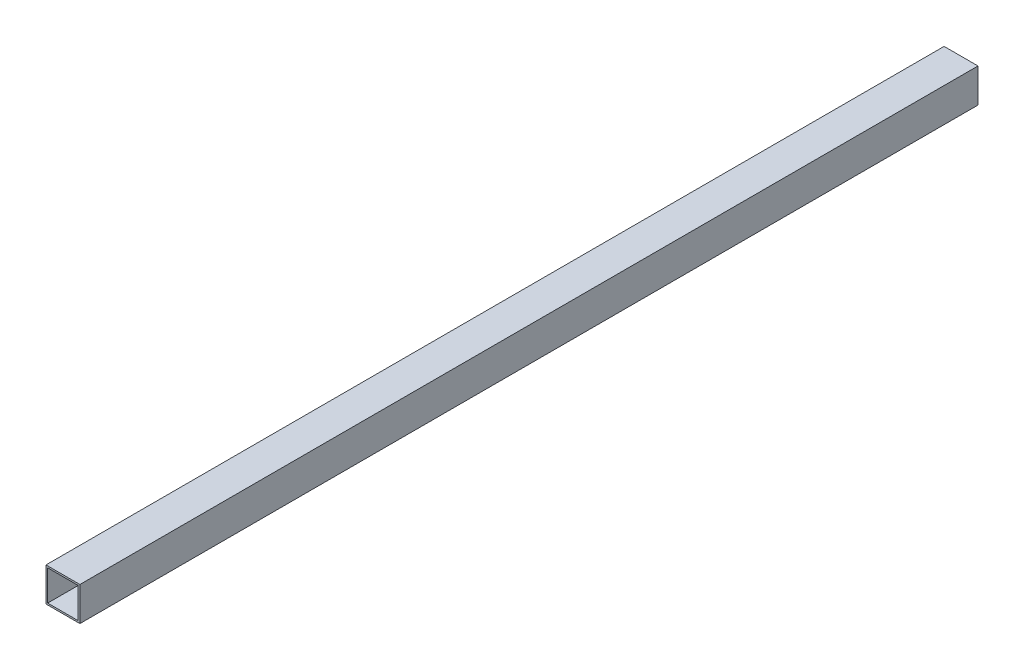
ISO-10303-21;
HEADER;
FILE_DESCRIPTION(('STEP AP214'),'2;1');
FILE_NAME('part.step','',(''),(''),'','','');
FILE_SCHEMA(('AUTOMOTIVE_DESIGN { 1 0 10303 214 1 1 1 1 }'));
ENDSEC;
DATA;
#1=APPLICATION_CONTEXT('core data for automotive mechanical design processes');
#2=APPLICATION_PROTOCOL_DEFINITION('international standard','automotive_design',2000,#1);
#3=PRODUCT_CONTEXT('',#1,'mechanical');
#4=PRODUCT('Part','Part','',(#3));
#5=PRODUCT_RELATED_PRODUCT_CATEGORY('part','',(#4));
#6=PRODUCT_DEFINITION_FORMATION('','',#4);
#7=PRODUCT_DEFINITION_CONTEXT('part definition',#1,'design');
#8=PRODUCT_DEFINITION('design','',#6,#7);
#9=PRODUCT_DEFINITION_SHAPE('','',#8);
#10=(LENGTH_UNIT() NAMED_UNIT(*) SI_UNIT(.MILLI.,.METRE.));
#11=(NAMED_UNIT(*) PLANE_ANGLE_UNIT() SI_UNIT($,.RADIAN.));
#12=(NAMED_UNIT(*) SI_UNIT($,.STERADIAN.) SOLID_ANGLE_UNIT());
#13=UNCERTAINTY_MEASURE_WITH_UNIT(LENGTH_MEASURE(1.E-05),#10,'distance_accuracy_value','');
#14=(GEOMETRIC_REPRESENTATION_CONTEXT(3) GLOBAL_UNCERTAINTY_ASSIGNED_CONTEXT((#13)) GLOBAL_UNIT_ASSIGNED_CONTEXT((#10,
#11,#12)) REPRESENTATION_CONTEXT('',''));
#15=CARTESIAN_POINT('',(0.,0.,0.));
#16=DIRECTION('',(0.,0.,1.));
#17=DIRECTION('',(1.,0.,0.));
#18=AXIS2_PLACEMENT_3D('',#15,#16,#17);
#19=CARTESIAN_POINT('',(-20.,-20.,1060.));
#20=DIRECTION('',(0.,0.,1.));
#21=DIRECTION('',(1.,0.,0.));
#22=AXIS2_PLACEMENT_3D('',#19,#20,#21);
#23=PLANE('',#22);
#24=DIRECTION('',(0.,-1.,0.));
#25=VECTOR('',#24,1.);
#26=CARTESIAN_POINT('',(-20.,-20.,1060.));
#27=LINE('',#26,#25);
#28=CARTESIAN_POINT('',(-20.,20.,1060.));
#29=VERTEX_POINT('',#28);
#30=CARTESIAN_POINT('',(-20.,-20.,1060.));
#31=VERTEX_POINT('',#30);
#32=EDGE_CURVE('E157',#29,#31,#27,.T.);
#33=ORIENTED_EDGE('',*,*,#32,.T.);
#34=DIRECTION('',(1.,0.,0.));
#35=VECTOR('',#34,1.);
#36=CARTESIAN_POINT('',(20.,-20.,1060.));
#37=LINE('',#36,#35);
#38=CARTESIAN_POINT('',(20.,-20.,1060.));
#39=VERTEX_POINT('',#38);
#40=EDGE_CURVE('E160',#31,#39,#37,.T.);
#41=ORIENTED_EDGE('',*,*,#40,.T.);
#42=DIRECTION('',(0.,1.,0.));
#43=VECTOR('',#42,1.);
#44=CARTESIAN_POINT('',(20.,-20.,1060.));
#45=LINE('',#44,#43);
#46=CARTESIAN_POINT('',(20.,20.,1060.));
#47=VERTEX_POINT('',#46);
#48=EDGE_CURVE('E163',#39,#47,#45,.T.);
#49=ORIENTED_EDGE('',*,*,#48,.T.);
#50=DIRECTION('',(-1.,0.,0.));
#51=VECTOR('',#50,1.);
#52=CARTESIAN_POINT('',(20.,20.,1060.));
#53=LINE('',#52,#51);
#54=EDGE_CURVE('E165',#47,#29,#53,.T.);
#55=ORIENTED_EDGE('',*,*,#54,.T.);
#56=EDGE_LOOP('',(#33,#41,#49,#55));
#57=FACE_BOUND('',#56,.T.);
#58=DIRECTION('',(1.,0.,0.));
#59=VECTOR('',#58,1.);
#60=CARTESIAN_POINT('',(20.,-18.,1060.));
#61=LINE('',#60,#59);
#62=CARTESIAN_POINT('',(-18.,-18.,1060.));
#63=VERTEX_POINT('',#62);
#64=CARTESIAN_POINT('',(18.,-18.,1060.));
#65=VERTEX_POINT('',#64);
#66=EDGE_CURVE('E129',#63,#65,#61,.T.);
#67=ORIENTED_EDGE('',*,*,#66,.F.);
#68=DIRECTION('',(0.,-1.,0.));
#69=VECTOR('',#68,1.);
#70=CARTESIAN_POINT('',(-18.,-20.,1060.));
#71=LINE('',#70,#69);
#72=CARTESIAN_POINT('',(-18.,18.,1060.));
#73=VERTEX_POINT('',#72);
#74=EDGE_CURVE('E121',#73,#63,#71,.T.);
#75=ORIENTED_EDGE('',*,*,#74,.F.);
#76=DIRECTION('',(-1.,0.,0.));
#77=VECTOR('',#76,1.);
#78=CARTESIAN_POINT('',(20.,18.,1060.));
#79=LINE('',#78,#77);
#80=CARTESIAN_POINT('',(18.,18.,1060.));
#81=VERTEX_POINT('',#80);
#82=EDGE_CURVE('E143',#81,#73,#79,.T.);
#83=ORIENTED_EDGE('',*,*,#82,.F.);
#84=DIRECTION('',(0.,1.,0.));
#85=VECTOR('',#84,1.);
#86=CARTESIAN_POINT('',(18.,-20.,1060.));
#87=LINE('',#86,#85);
#88=EDGE_CURVE('E141',#65,#81,#87,.T.);
#89=ORIENTED_EDGE('',*,*,#88,.F.);
#90=EDGE_LOOP('',(#67,#75,#83,#89));
#91=FACE_BOUND('',#90,.T.);
#92=ADVANCED_FACE('F56',(#57,#91),#23,.T.);
#93=CARTESIAN_POINT('',(-20.,-20.,0.));
#94=DIRECTION('',(0.,0.,1.));
#95=DIRECTION('',(1.,0.,0.));
#96=AXIS2_PLACEMENT_3D('',#93,#94,#95);
#97=PLANE('',#96);
#98=DIRECTION('',(0.,-1.,0.));
#99=VECTOR('',#98,1.);
#100=CARTESIAN_POINT('',(-20.,-20.,0.));
#101=LINE('',#100,#99);
#102=CARTESIAN_POINT('',(-20.,20.,0.));
#103=VERTEX_POINT('',#102);
#104=CARTESIAN_POINT('',(-20.,-20.,0.));
#105=VERTEX_POINT('',#104);
#106=EDGE_CURVE('E137',#103,#105,#101,.T.);
#107=ORIENTED_EDGE('',*,*,#106,.F.);
#108=DIRECTION('',(-1.,0.,0.));
#109=VECTOR('',#108,1.);
#110=CARTESIAN_POINT('',(20.,20.,0.));
#111=LINE('',#110,#109);
#112=CARTESIAN_POINT('',(20.,20.,0.));
#113=VERTEX_POINT('',#112);
#114=EDGE_CURVE('E161',#113,#103,#111,.T.);
#115=ORIENTED_EDGE('',*,*,#114,.F.);
#116=DIRECTION('',(0.,1.,0.));
#117=VECTOR('',#116,1.);
#118=CARTESIAN_POINT('',(20.,-20.,0.));
#119=LINE('',#118,#117);
#120=CARTESIAN_POINT('',(20.,-20.,0.));
#121=VERTEX_POINT('',#120);
#122=EDGE_CURVE('E172',#121,#113,#119,.T.);
#123=ORIENTED_EDGE('',*,*,#122,.F.);
#124=DIRECTION('',(1.,0.,0.));
#125=VECTOR('',#124,1.);
#126=CARTESIAN_POINT('',(20.,-20.,0.));
#127=LINE('',#126,#125);
#128=EDGE_CURVE('E170',#105,#121,#127,.T.);
#129=ORIENTED_EDGE('',*,*,#128,.F.);
#130=EDGE_LOOP('',(#107,#115,#123,#129));
#131=FACE_BOUND('',#130,.T.);
#132=DIRECTION('',(0.,-1.,0.));
#133=VECTOR('',#132,1.);
#134=CARTESIAN_POINT('',(-18.,-20.,0.));
#135=LINE('',#134,#133);
#136=CARTESIAN_POINT('',(-18.,18.,0.));
#137=VERTEX_POINT('',#136);
#138=CARTESIAN_POINT('',(-18.,-18.,0.));
#139=VERTEX_POINT('',#138);
#140=EDGE_CURVE('E79',#137,#139,#135,.T.);
#141=ORIENTED_EDGE('',*,*,#140,.T.);
#142=DIRECTION('',(1.,0.,0.));
#143=VECTOR('',#142,1.);
#144=CARTESIAN_POINT('',(20.,-18.,0.));
#145=LINE('',#144,#143);
#146=CARTESIAN_POINT('',(18.,-18.,0.));
#147=VERTEX_POINT('',#146);
#148=EDGE_CURVE('E136',#139,#147,#145,.T.);
#149=ORIENTED_EDGE('',*,*,#148,.T.);
#150=DIRECTION('',(0.,1.,0.));
#151=VECTOR('',#150,1.);
#152=CARTESIAN_POINT('',(18.,-20.,0.));
#153=LINE('',#152,#151);
#154=CARTESIAN_POINT('',(18.,18.,0.));
#155=VERTEX_POINT('',#154);
#156=EDGE_CURVE('E149',#147,#155,#153,.T.);
#157=ORIENTED_EDGE('',*,*,#156,.T.);
#158=DIRECTION('',(-1.,0.,0.));
#159=VECTOR('',#158,1.);
#160=CARTESIAN_POINT('',(20.,18.,0.));
#161=LINE('',#160,#159);
#162=EDGE_CURVE('E130',#155,#137,#161,.T.);
#163=ORIENTED_EDGE('',*,*,#162,.T.);
#164=EDGE_LOOP('',(#141,#149,#157,#163));
#165=FACE_BOUND('',#164,.T.);
#166=ADVANCED_FACE('F190',(#131,#165),#97,.F.);
#167=CARTESIAN_POINT('',(-20.,-20.,1060.));
#168=DIRECTION('',(1.,0.,0.));
#169=DIRECTION('',(0.,0.,-1.));
#170=AXIS2_PLACEMENT_3D('',#167,#168,#169);
#171=PLANE('',#170);
#172=ORIENTED_EDGE('',*,*,#106,.T.);
#173=DIRECTION('',(0.,0.,-1.));
#174=VECTOR('',#173,1.);
#175=CARTESIAN_POINT('',(-20.,-20.,1060.));
#176=LINE('',#175,#174);
#177=EDGE_CURVE('E12',#31,#105,#176,.T.);
#178=ORIENTED_EDGE('',*,*,#177,.F.);
#179=ORIENTED_EDGE('',*,*,#32,.F.);
#180=DIRECTION('',(0.,0.,-1.));
#181=VECTOR('',#180,1.);
#182=CARTESIAN_POINT('',(-20.,20.,1060.));
#183=LINE('',#182,#181);
#184=EDGE_CURVE('E167',#29,#103,#183,.T.);
#185=ORIENTED_EDGE('',*,*,#184,.T.);
#186=EDGE_LOOP('',(#172,#178,#179,#185));
#187=FACE_BOUND('',#186,.T.);
#188=ADVANCED_FACE('F58',(#187),#171,.F.);
#189=CARTESIAN_POINT('',(20.,-20.,1060.));
#190=DIRECTION('',(0.,1.,0.));
#191=DIRECTION('',(-1.,0.,0.));
#192=AXIS2_PLACEMENT_3D('',#189,#190,#191);
#193=PLANE('',#192);
#194=ORIENTED_EDGE('',*,*,#128,.T.);
#195=DIRECTION('',(0.,0.,-1.));
#196=VECTOR('',#195,1.);
#197=CARTESIAN_POINT('',(20.,-20.,1060.));
#198=LINE('',#197,#196);
#199=EDGE_CURVE('E64',#39,#121,#198,.T.);
#200=ORIENTED_EDGE('',*,*,#199,.F.);
#201=ORIENTED_EDGE('',*,*,#40,.F.);
#202=ORIENTED_EDGE('',*,*,#177,.T.);
#203=EDGE_LOOP('',(#194,#200,#201,#202));
#204=FACE_BOUND('',#203,.T.);
#205=ADVANCED_FACE('F200',(#204),#193,.F.);
#206=CARTESIAN_POINT('',(20.,-20.,1060.));
#207=DIRECTION('',(-1.,0.,0.));
#208=DIRECTION('',(0.,0.,1.));
#209=AXIS2_PLACEMENT_3D('',#206,#207,#208);
#210=PLANE('',#209);
#211=ORIENTED_EDGE('',*,*,#122,.T.);
#212=DIRECTION('',(0.,0.,-1.));
#213=VECTOR('',#212,1.);
#214=CARTESIAN_POINT('',(20.,20.,1060.));
#215=LINE('',#214,#213);
#216=EDGE_CURVE('E177',#47,#113,#215,.T.);
#217=ORIENTED_EDGE('',*,*,#216,.F.);
#218=ORIENTED_EDGE('',*,*,#48,.F.);
#219=ORIENTED_EDGE('',*,*,#199,.T.);
#220=EDGE_LOOP('',(#211,#217,#218,#219));
#221=FACE_BOUND('',#220,.T.);
#222=ADVANCED_FACE('F184',(#221),#210,.F.);
#223=CARTESIAN_POINT('',(20.,20.,1060.));
#224=DIRECTION('',(0.,-1.,0.));
#225=DIRECTION('',(1.,0.,0.));
#226=AXIS2_PLACEMENT_3D('',#223,#224,#225);
#227=PLANE('',#226);
#228=ORIENTED_EDGE('',*,*,#114,.T.);
#229=ORIENTED_EDGE('',*,*,#184,.F.);
#230=ORIENTED_EDGE('',*,*,#54,.F.);
#231=ORIENTED_EDGE('',*,*,#216,.T.);
#232=EDGE_LOOP('',(#228,#229,#230,#231));
#233=FACE_BOUND('',#232,.T.);
#234=ADVANCED_FACE('F194',(#233),#227,.F.);
#235=CARTESIAN_POINT('',(-18.,-20.,1060.));
#236=DIRECTION('',(1.,0.,0.));
#237=DIRECTION('',(0.,0.,-1.));
#238=AXIS2_PLACEMENT_3D('',#235,#236,#237);
#239=PLANE('',#238);
#240=ORIENTED_EDGE('',*,*,#140,.F.);
#241=DIRECTION('',(0.,0.,-1.));
#242=VECTOR('',#241,1.);
#243=CARTESIAN_POINT('',(-18.,18.,1060.));
#244=LINE('',#243,#242);
#245=EDGE_CURVE('E125',#73,#137,#244,.T.);
#246=ORIENTED_EDGE('',*,*,#245,.F.);
#247=ORIENTED_EDGE('',*,*,#74,.T.);
#248=DIRECTION('',(0.,0.,-1.));
#249=VECTOR('',#248,1.);
#250=CARTESIAN_POINT('',(-18.,-18.,1060.));
#251=LINE('',#250,#249);
#252=EDGE_CURVE('E124',#63,#139,#251,.T.);
#253=ORIENTED_EDGE('',*,*,#252,.T.);
#254=EDGE_LOOP('',(#240,#246,#247,#253));
#255=FACE_BOUND('',#254,.T.);
#256=ADVANCED_FACE('F123',(#255),#239,.T.);
#257=CARTESIAN_POINT('',(20.,-18.,1060.));
#258=DIRECTION('',(0.,1.,0.));
#259=DIRECTION('',(-1.,0.,0.));
#260=AXIS2_PLACEMENT_3D('',#257,#258,#259);
#261=PLANE('',#260);
#262=ORIENTED_EDGE('',*,*,#148,.F.);
#263=ORIENTED_EDGE('',*,*,#252,.F.);
#264=ORIENTED_EDGE('',*,*,#66,.T.);
#265=DIRECTION('',(0.,0.,-1.));
#266=VECTOR('',#265,1.);
#267=CARTESIAN_POINT('',(18.,-18.,1060.));
#268=LINE('',#267,#266);
#269=EDGE_CURVE('E138',#65,#147,#268,.T.);
#270=ORIENTED_EDGE('',*,*,#269,.T.);
#271=EDGE_LOOP('',(#262,#263,#264,#270));
#272=FACE_BOUND('',#271,.T.);
#273=ADVANCED_FACE('F133',(#272),#261,.T.);
#274=CARTESIAN_POINT('',(18.,-20.,1060.));
#275=DIRECTION('',(-1.,0.,0.));
#276=DIRECTION('',(0.,0.,1.));
#277=AXIS2_PLACEMENT_3D('',#274,#275,#276);
#278=PLANE('',#277);
#279=ORIENTED_EDGE('',*,*,#156,.F.);
#280=ORIENTED_EDGE('',*,*,#269,.F.);
#281=ORIENTED_EDGE('',*,*,#88,.T.);
#282=DIRECTION('',(0.,0.,-1.));
#283=VECTOR('',#282,1.);
#284=CARTESIAN_POINT('',(18.,18.,1060.));
#285=LINE('',#284,#283);
#286=EDGE_CURVE('E71',#81,#155,#285,.T.);
#287=ORIENTED_EDGE('',*,*,#286,.T.);
#288=EDGE_LOOP('',(#279,#280,#281,#287));
#289=FACE_BOUND('',#288,.T.);
#290=ADVANCED_FACE('F223',(#289),#278,.T.);
#291=CARTESIAN_POINT('',(20.,18.,1060.));
#292=DIRECTION('',(0.,-1.,0.));
#293=DIRECTION('',(1.,0.,0.));
#294=AXIS2_PLACEMENT_3D('',#291,#292,#293);
#295=PLANE('',#294);
#296=ORIENTED_EDGE('',*,*,#162,.F.);
#297=ORIENTED_EDGE('',*,*,#286,.F.);
#298=ORIENTED_EDGE('',*,*,#82,.T.);
#299=ORIENTED_EDGE('',*,*,#245,.T.);
#300=EDGE_LOOP('',(#296,#297,#298,#299));
#301=FACE_BOUND('',#300,.T.);
#302=ADVANCED_FACE('F227',(#301),#295,.T.);
#303=CLOSED_SHELL('',(#92,#166,#188,#205,#222,#234,#256,#273,#290,#302));
#304=MANIFOLD_SOLID_BREP('B2',#303);
#305=ADVANCED_BREP_SHAPE_REPRESENTATION('',(#18,#304),#14);
#306=SHAPE_DEFINITION_REPRESENTATION(#9,#305);
ENDSEC;
END-ISO-10303-21;
